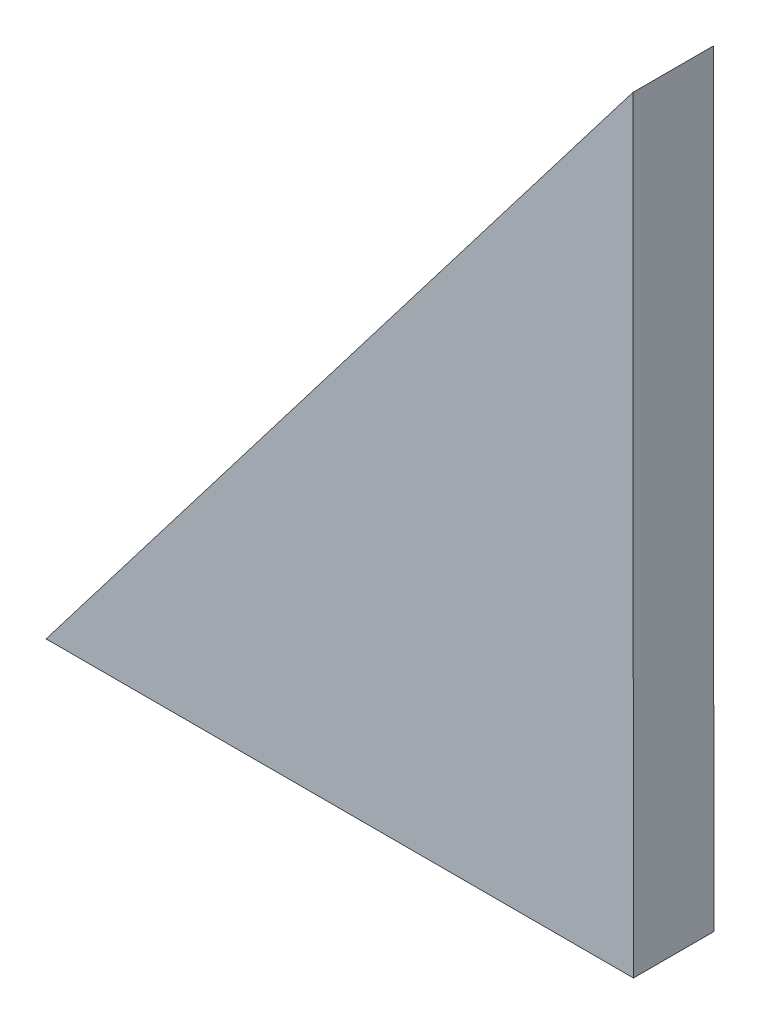
ISO-10303-21;
HEADER;
FILE_DESCRIPTION(('STEP AP214'),'2;1');
FILE_NAME('part.step','',(''),(''),'','','');
FILE_SCHEMA(('AUTOMOTIVE_DESIGN { 1 0 10303 214 1 1 1 1 }'));
ENDSEC;
DATA;
#1=APPLICATION_CONTEXT('core data for automotive mechanical design processes');
#2=APPLICATION_PROTOCOL_DEFINITION('international standard','automotive_design',2000,#1);
#3=PRODUCT_CONTEXT('',#1,'mechanical');
#4=PRODUCT('Part','Part','',(#3));
#5=PRODUCT_RELATED_PRODUCT_CATEGORY('part','',(#4));
#6=PRODUCT_DEFINITION_FORMATION('','',#4);
#7=PRODUCT_DEFINITION_CONTEXT('part definition',#1,'design');
#8=PRODUCT_DEFINITION('design','',#6,#7);
#9=PRODUCT_DEFINITION_SHAPE('','',#8);
#10=(LENGTH_UNIT() NAMED_UNIT(*) SI_UNIT(.MILLI.,.METRE.));
#11=(NAMED_UNIT(*) PLANE_ANGLE_UNIT() SI_UNIT($,.RADIAN.));
#12=(NAMED_UNIT(*) SI_UNIT($,.STERADIAN.) SOLID_ANGLE_UNIT());
#13=UNCERTAINTY_MEASURE_WITH_UNIT(LENGTH_MEASURE(1.E-05),#10,'distance_accuracy_value','');
#14=(GEOMETRIC_REPRESENTATION_CONTEXT(3) GLOBAL_UNCERTAINTY_ASSIGNED_CONTEXT((#13)) GLOBAL_UNIT_ASSIGNED_CONTEXT((#10,
#11,#12)) REPRESENTATION_CONTEXT('',''));
#15=CARTESIAN_POINT('',(0.,0.,0.));
#16=DIRECTION('',(0.,0.,1.));
#17=DIRECTION('',(1.,0.,0.));
#18=AXIS2_PLACEMENT_3D('',#15,#16,#17);
#19=CARTESIAN_POINT('',(-92.7285377767646,1.4210854715202E-11,12.7));
#20=DIRECTION('',(0.794096490407273,-0.607791710969188,0.));
#21=DIRECTION('',(0.607791710969188,0.794096490407273,0.));
#22=AXIS2_PLACEMENT_3D('',#19,#20,#21);
#23=PLANE('',#22);
#24=DIRECTION('',(-0.607791710969187,-0.794096490407272,0.));
#25=VECTOR('',#24,1.);
#26=CARTESIAN_POINT('',(-92.7285377767646,1.4210854715202E-11,0.));
#27=LINE('',#26,#25);
#28=CARTESIAN_POINT('',(-0.101081025067281,121.020305138074,0.));
#29=VERTEX_POINT('',#28);
#30=CARTESIAN_POINT('',(-92.7285377767646,1.4210854715202E-11,0.));
#31=VERTEX_POINT('',#30);
#32=EDGE_CURVE('E78',#29,#31,#27,.T.);
#33=ORIENTED_EDGE('',*,*,#32,.T.);
#34=DIRECTION('',(0.,0.,-1.));
#35=VECTOR('',#34,1.);
#36=CARTESIAN_POINT('',(-92.7285377767646,1.4210854715202E-11,12.7));
#37=LINE('',#36,#35);
#38=CARTESIAN_POINT('',(-92.7285377767646,1.4210854715202E-11,12.7));
#39=VERTEX_POINT('',#38);
#40=EDGE_CURVE('E11',#39,#31,#37,.T.);
#41=ORIENTED_EDGE('',*,*,#40,.F.);
#42=DIRECTION('',(-0.607791710969187,-0.794096490407272,0.));
#43=VECTOR('',#42,1.);
#44=CARTESIAN_POINT('',(-92.7285377767646,1.4210854715202E-11,12.7));
#45=LINE('',#44,#43);
#46=CARTESIAN_POINT('',(-0.101081025067281,121.020305138074,12.7));
#47=VERTEX_POINT('',#46);
#48=EDGE_CURVE('E71',#47,#39,#45,.T.);
#49=ORIENTED_EDGE('',*,*,#48,.F.);
#50=DIRECTION('',(0.,0.,-1.));
#51=VECTOR('',#50,1.);
#52=CARTESIAN_POINT('',(-0.101081025067281,121.020305138074,12.7));
#53=LINE('',#52,#51);
#54=EDGE_CURVE('E79',#47,#29,#53,.T.);
#55=ORIENTED_EDGE('',*,*,#54,.T.);
#56=EDGE_LOOP('',(#33,#41,#49,#55));
#57=FACE_BOUND('',#56,.T.);
#58=ADVANCED_FACE('F31',(#57),#23,.F.);
#59=CARTESIAN_POINT('',(0.,0.,12.7));
#60=DIRECTION('',(1.53252224783414E-13,1.,0.));
#61=DIRECTION('',(-1.,1.53252224783414E-13,0.));
#62=AXIS2_PLACEMENT_3D('',#59,#60,#61);
#63=PLANE('',#62);
#64=DIRECTION('',(1.,-1.53252224783414E-13,0.));
#65=VECTOR('',#64,1.);
#66=CARTESIAN_POINT('',(0.,0.,0.));
#67=LINE('',#66,#65);
#68=CARTESIAN_POINT('',(0.,0.,0.));
#69=VERTEX_POINT('',#68);
#70=EDGE_CURVE('E59',#31,#69,#67,.T.);
#71=ORIENTED_EDGE('',*,*,#70,.T.);
#72=DIRECTION('',(0.,0.,-1.));
#73=VECTOR('',#72,1.);
#74=CARTESIAN_POINT('',(0.,0.,12.7));
#75=LINE('',#74,#73);
#76=CARTESIAN_POINT('',(0.,0.,12.7));
#77=VERTEX_POINT('',#76);
#78=EDGE_CURVE('E39',#77,#69,#75,.T.);
#79=ORIENTED_EDGE('',*,*,#78,.F.);
#80=DIRECTION('',(1.,-1.53252224783414E-13,0.));
#81=VECTOR('',#80,1.);
#82=CARTESIAN_POINT('',(0.,0.,12.7));
#83=LINE('',#82,#81);
#84=EDGE_CURVE('E67',#39,#77,#83,.T.);
#85=ORIENTED_EDGE('',*,*,#84,.F.);
#86=ORIENTED_EDGE('',*,*,#40,.T.);
#87=EDGE_LOOP('',(#71,#79,#85,#86));
#88=FACE_BOUND('',#87,.T.);
#89=ADVANCED_FACE('F68',(#88),#63,.F.);
#90=CARTESIAN_POINT('',(-0.101081025067281,121.020305138074,12.7));
#91=DIRECTION('',(-0.999999651187078,-0.000835239918570596,0.));
#92=DIRECTION('',(0.000835239918570597,-0.999999651187079,0.));
#93=AXIS2_PLACEMENT_3D('',#90,#91,#92);
#94=PLANE('',#93);
#95=DIRECTION('',(-0.000835239918570596,0.999999651187078,0.));
#96=VECTOR('',#95,1.);
#97=CARTESIAN_POINT('',(-0.101081025067281,121.020305138074,0.));
#98=LINE('',#97,#96);
#99=EDGE_CURVE('E64',#69,#29,#98,.T.);
#100=ORIENTED_EDGE('',*,*,#99,.T.);
#101=ORIENTED_EDGE('',*,*,#54,.F.);
#102=DIRECTION('',(-0.000835239918570596,0.999999651187078,0.));
#103=VECTOR('',#102,1.);
#104=CARTESIAN_POINT('',(-0.101081025067281,121.020305138074,12.7));
#105=LINE('',#104,#103);
#106=EDGE_CURVE('E47',#77,#47,#105,.T.);
#107=ORIENTED_EDGE('',*,*,#106,.F.);
#108=ORIENTED_EDGE('',*,*,#78,.T.);
#109=EDGE_LOOP('',(#100,#101,#107,#108));
#110=FACE_BOUND('',#109,.T.);
#111=ADVANCED_FACE('F86',(#110),#94,.F.);
#112=CARTESIAN_POINT('',(-92.7285377767646,1.4210854715202E-11,12.7));
#113=DIRECTION('',(0.,0.,1.));
#114=DIRECTION('',(1.,0.,0.));
#115=AXIS2_PLACEMENT_3D('',#112,#113,#114);
#116=PLANE('',#115);
#117=ORIENTED_EDGE('',*,*,#48,.T.);
#118=ORIENTED_EDGE('',*,*,#84,.T.);
#119=ORIENTED_EDGE('',*,*,#106,.T.);
#120=EDGE_LOOP('',(#117,#118,#119));
#121=FACE_BOUND('',#120,.T.);
#122=ADVANCED_FACE('F74',(#121),#116,.T.);
#123=CARTESIAN_POINT('',(-92.7285377767646,1.4210854715202E-11,0.));
#124=DIRECTION('',(0.,0.,1.));
#125=DIRECTION('',(1.,0.,0.));
#126=AXIS2_PLACEMENT_3D('',#123,#124,#125);
#127=PLANE('',#126);
#128=ORIENTED_EDGE('',*,*,#32,.F.);
#129=ORIENTED_EDGE('',*,*,#99,.F.);
#130=ORIENTED_EDGE('',*,*,#70,.F.);
#131=EDGE_LOOP('',(#128,#129,#130));
#132=FACE_BOUND('',#131,.T.);
#133=ADVANCED_FACE('F87',(#132),#127,.F.);
#134=CLOSED_SHELL('',(#58,#89,#111,#122,#133));
#135=MANIFOLD_SOLID_BREP('B2',#134);
#136=ADVANCED_BREP_SHAPE_REPRESENTATION('',(#18,#135),#14);
#137=SHAPE_DEFINITION_REPRESENTATION(#9,#136);
ENDSEC;
END-ISO-10303-21;
